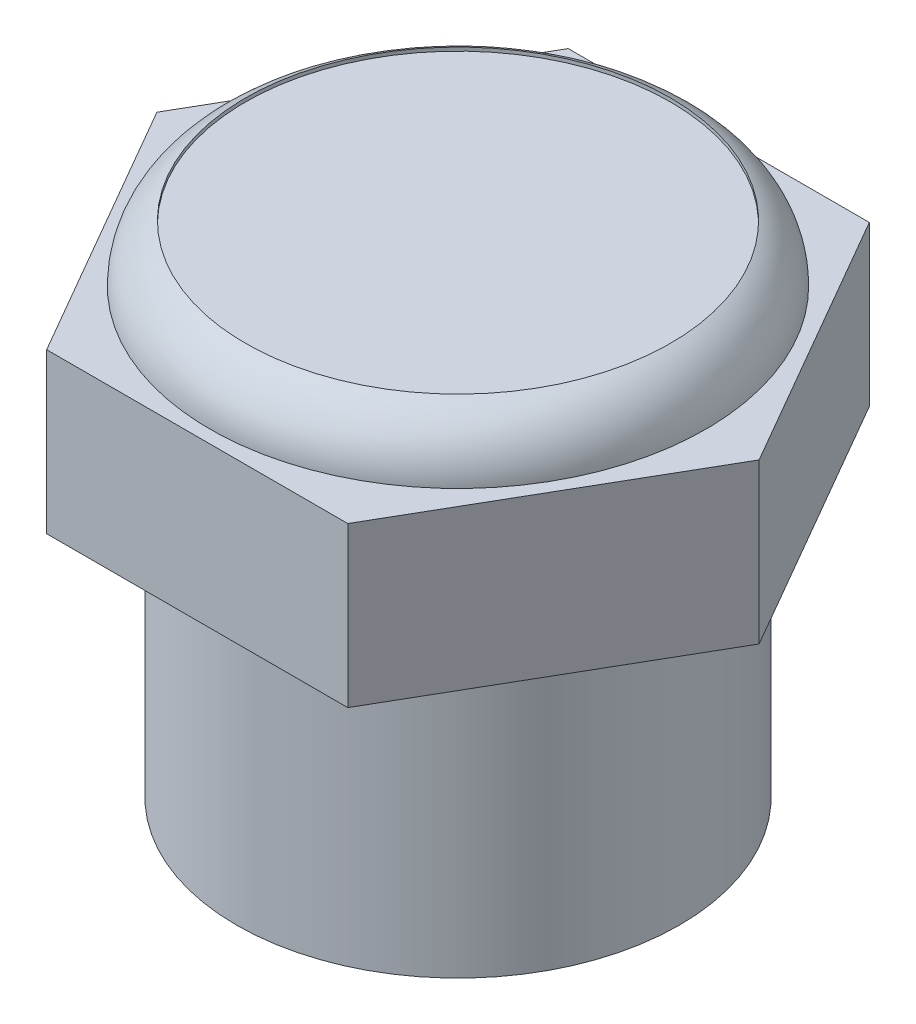
ISO-10303-21;
HEADER;
FILE_DESCRIPTION(('STEP AP214'),'2;1');
FILE_NAME('part.step','',(''),(''),'','','');
FILE_SCHEMA(('AUTOMOTIVE_DESIGN { 1 0 10303 214 1 1 1 1 }'));
ENDSEC;
DATA;
#1=APPLICATION_CONTEXT('core data for automotive mechanical design processes');
#2=APPLICATION_PROTOCOL_DEFINITION('international standard','automotive_design',2000,#1);
#3=PRODUCT_CONTEXT('',#1,'mechanical');
#4=PRODUCT('Part','Part','',(#3));
#5=PRODUCT_RELATED_PRODUCT_CATEGORY('part','',(#4));
#6=PRODUCT_DEFINITION_FORMATION('','',#4);
#7=PRODUCT_DEFINITION_CONTEXT('part definition',#1,'design');
#8=PRODUCT_DEFINITION('design','',#6,#7);
#9=PRODUCT_DEFINITION_SHAPE('','',#8);
#10=(LENGTH_UNIT() NAMED_UNIT(*) SI_UNIT(.MILLI.,.METRE.));
#11=(NAMED_UNIT(*) PLANE_ANGLE_UNIT() SI_UNIT($,.RADIAN.));
#12=(NAMED_UNIT(*) SI_UNIT($,.STERADIAN.) SOLID_ANGLE_UNIT());
#13=UNCERTAINTY_MEASURE_WITH_UNIT(LENGTH_MEASURE(1.E-05),#10,'distance_accuracy_value','');
#14=(GEOMETRIC_REPRESENTATION_CONTEXT(3) GLOBAL_UNCERTAINTY_ASSIGNED_CONTEXT((#13)) GLOBAL_UNIT_ASSIGNED_CONTEXT((#10,
#11,#12)) REPRESENTATION_CONTEXT('',''));
#15=CARTESIAN_POINT('',(0.,0.,0.));
#16=DIRECTION('',(0.,0.,1.));
#17=DIRECTION('',(1.,0.,0.));
#18=AXIS2_PLACEMENT_3D('',#15,#16,#17);
#19=CARTESIAN_POINT('',(0.,0.,0.));
#20=DIRECTION('',(0.,1.,0.));
#21=DIRECTION('',(0.,0.,1.));
#22=AXIS2_PLACEMENT_3D('',#19,#20,#21);
#23=PLANE('',#22);
#24=CARTESIAN_POINT('',(0.,0.,0.));
#25=DIRECTION('',(0.,1.,0.));
#26=DIRECTION('',(0.,0.,1.));
#27=AXIS2_PLACEMENT_3D('',#24,#25,#26);
#28=CIRCLE('',#27,6.25);
#29=CARTESIAN_POINT('',(0.,0.,6.25));
#30=VERTEX_POINT('',#29);
#31=EDGE_CURVE('E56',#30,#30,#28,.T.);
#32=ORIENTED_EDGE('',*,*,#31,.F.);
#33=EDGE_LOOP('',(#32));
#34=FACE_BOUND('',#33,.T.);
#35=CARTESIAN_POINT('',(0.,0.,0.));
#36=DIRECTION('',(0.,1.,0.));
#37=DIRECTION('',(0.,0.,1.));
#38=AXIS2_PLACEMENT_3D('',#35,#36,#37);
#39=CIRCLE('',#38,4.5);
#40=CARTESIAN_POINT('',(0.,0.,4.5));
#41=VERTEX_POINT('',#40);
#42=EDGE_CURVE('E168',#41,#41,#39,.T.);
#43=ORIENTED_EDGE('',*,*,#42,.T.);
#44=EDGE_LOOP('',(#43));
#45=FACE_BOUND('',#44,.T.);
#46=ADVANCED_FACE('F52',(#34,#45),#23,.F.);
#47=CARTESIAN_POINT('',(0.,8.,0.));
#48=DIRECTION('',(0.,-1.,0.));
#49=DIRECTION('',(0.,0.,-1.));
#50=AXIS2_PLACEMENT_3D('',#47,#48,#49);
#51=CYLINDRICAL_SURFACE('',#50,6.25);
#52=CARTESIAN_POINT('',(0.,8.,0.));
#53=DIRECTION('',(0.,1.,0.));
#54=DIRECTION('',(0.,0.,1.));
#55=AXIS2_PLACEMENT_3D('',#52,#53,#54);
#56=CIRCLE('',#55,6.25);
#57=CARTESIAN_POINT('',(0.,8.,6.25));
#58=VERTEX_POINT('',#57);
#59=EDGE_CURVE('E13',#58,#58,#56,.T.);
#60=ORIENTED_EDGE('',*,*,#59,.F.);
#61=EDGE_LOOP('',(#60));
#62=FACE_BOUND('',#61,.T.);
#63=ORIENTED_EDGE('',*,*,#31,.T.);
#64=EDGE_LOOP('',(#63));
#65=FACE_BOUND('',#64,.T.);
#66=ADVANCED_FACE('F54',(#62,#65),#51,.T.);
#67=CARTESIAN_POINT('',(0.,8.,0.));
#68=DIRECTION('',(0.,-1.,0.));
#69=DIRECTION('',(0.,0.,-1.));
#70=AXIS2_PLACEMENT_3D('',#67,#68,#69);
#71=CYLINDRICAL_SURFACE('',#70,4.5);
#72=CARTESIAN_POINT('',(0.,8.,0.));
#73=DIRECTION('',(0.,1.,0.));
#74=DIRECTION('',(0.,0.,1.));
#75=AXIS2_PLACEMENT_3D('',#72,#73,#74);
#76=CIRCLE('',#75,4.5);
#77=CARTESIAN_POINT('',(0.,8.,4.5));
#78=VERTEX_POINT('',#77);
#79=EDGE_CURVE('E164',#78,#78,#76,.T.);
#80=ORIENTED_EDGE('',*,*,#79,.T.);
#81=EDGE_LOOP('',(#80));
#82=FACE_BOUND('',#81,.T.);
#83=ORIENTED_EDGE('',*,*,#42,.F.);
#84=EDGE_LOOP('',(#83));
#85=FACE_BOUND('',#84,.T.);
#86=ADVANCED_FACE('F185',(#82,#85),#71,.F.);
#87=CARTESIAN_POINT('',(0.,8.,0.));
#88=DIRECTION('',(0.,1.,0.));
#89=DIRECTION('',(0.,0.,1.));
#90=AXIS2_PLACEMENT_3D('',#87,#88,#89);
#91=PLANE('',#90);
#92=ORIENTED_EDGE('',*,*,#79,.F.);
#93=EDGE_LOOP('',(#92));
#94=FACE_BOUND('',#93,.T.);
#95=ADVANCED_FACE('F190',(#94),#91,.F.);
#96=CARTESIAN_POINT('',(8.5,12.5,0.));
#97=DIRECTION('',(-0.866025403784439,0.,0.5));
#98=DIRECTION('',(0.5,0.,0.866025403784439));
#99=AXIS2_PLACEMENT_3D('',#96,#97,#98);
#100=PLANE('',#99);
#101=DIRECTION('',(-0.5,0.,-0.866025403784439));
#102=VECTOR('',#101,1.);
#103=CARTESIAN_POINT('',(8.5,8.,0.));
#104=LINE('',#103,#102);
#105=CARTESIAN_POINT('',(8.5,8.,0.));
#106=VERTEX_POINT('',#105);
#107=CARTESIAN_POINT('',(4.25,8.,-7.36121593216773));
#108=VERTEX_POINT('',#107);
#109=EDGE_CURVE('E143',#106,#108,#104,.T.);
#110=ORIENTED_EDGE('',*,*,#109,.T.);
#111=DIRECTION('',(0.,-1.,0.));
#112=VECTOR('',#111,1.);
#113=CARTESIAN_POINT('',(4.25,12.5,-7.36121593216773));
#114=LINE('',#113,#112);
#115=CARTESIAN_POINT('',(4.25,12.5,-7.36121593216773));
#116=VERTEX_POINT('',#115);
#117=EDGE_CURVE('E162',#116,#108,#114,.T.);
#118=ORIENTED_EDGE('',*,*,#117,.F.);
#119=DIRECTION('',(-0.5,0.,-0.866025403784439));
#120=VECTOR('',#119,1.);
#121=CARTESIAN_POINT('',(8.5,12.5,0.));
#122=LINE('',#121,#120);
#123=CARTESIAN_POINT('',(8.5,12.5,0.));
#124=VERTEX_POINT('',#123);
#125=EDGE_CURVE('E155',#124,#116,#122,.T.);
#126=ORIENTED_EDGE('',*,*,#125,.F.);
#127=DIRECTION('',(0.,-1.,0.));
#128=VECTOR('',#127,1.);
#129=CARTESIAN_POINT('',(8.5,12.5,0.));
#130=LINE('',#129,#128);
#131=EDGE_CURVE('E139',#124,#106,#130,.T.);
#132=ORIENTED_EDGE('',*,*,#131,.T.);
#133=EDGE_LOOP('',(#110,#118,#126,#132));
#134=FACE_BOUND('',#133,.T.);
#135=ADVANCED_FACE('F192',(#134),#100,.F.);
#136=CARTESIAN_POINT('',(4.25,12.5,-7.36121593216773));
#137=DIRECTION('',(0.,0.,1.));
#138=DIRECTION('',(1.,0.,0.));
#139=AXIS2_PLACEMENT_3D('',#136,#137,#138);
#140=PLANE('',#139);
#141=DIRECTION('',(-1.,0.,0.));
#142=VECTOR('',#141,1.);
#143=CARTESIAN_POINT('',(4.25,8.,-7.36121593216773));
#144=LINE('',#143,#142);
#145=CARTESIAN_POINT('',(-4.25,8.,-7.36121593216773));
#146=VERTEX_POINT('',#145);
#147=EDGE_CURVE('E146',#108,#146,#144,.T.);
#148=ORIENTED_EDGE('',*,*,#147,.T.);
#149=DIRECTION('',(0.,-1.,0.));
#150=VECTOR('',#149,1.);
#151=CARTESIAN_POINT('',(-4.25,12.5,-7.36121593216773));
#152=LINE('',#151,#150);
#153=CARTESIAN_POINT('',(-4.25,12.5,-7.36121593216773));
#154=VERTEX_POINT('',#153);
#155=EDGE_CURVE('E159',#154,#146,#152,.T.);
#156=ORIENTED_EDGE('',*,*,#155,.F.);
#157=DIRECTION('',(-1.,0.,0.));
#158=VECTOR('',#157,1.);
#159=CARTESIAN_POINT('',(4.25,12.5,-7.36121593216773));
#160=LINE('',#159,#158);
#161=EDGE_CURVE('E108',#116,#154,#160,.T.);
#162=ORIENTED_EDGE('',*,*,#161,.F.);
#163=ORIENTED_EDGE('',*,*,#117,.T.);
#164=EDGE_LOOP('',(#148,#156,#162,#163));
#165=FACE_BOUND('',#164,.T.);
#166=ADVANCED_FACE('F195',(#165),#140,.F.);
#167=CARTESIAN_POINT('',(-4.25,12.5,-7.36121593216773));
#168=DIRECTION('',(0.866025403784439,0.,0.5));
#169=DIRECTION('',(0.5,0.,-0.866025403784439));
#170=AXIS2_PLACEMENT_3D('',#167,#168,#169);
#171=PLANE('',#170);
#172=DIRECTION('',(-0.5,0.,0.866025403784439));
#173=VECTOR('',#172,1.);
#174=CARTESIAN_POINT('',(-4.25,8.,-7.36121593216773));
#175=LINE('',#174,#173);
#176=CARTESIAN_POINT('',(-8.5,8.,0.));
#177=VERTEX_POINT('',#176);
#178=EDGE_CURVE('E149',#146,#177,#175,.T.);
#179=ORIENTED_EDGE('',*,*,#178,.T.);
#180=DIRECTION('',(0.,-1.,0.));
#181=VECTOR('',#180,1.);
#182=CARTESIAN_POINT('',(-8.5,12.5,0.));
#183=LINE('',#182,#181);
#184=CARTESIAN_POINT('',(-8.5,12.5,0.));
#185=VERTEX_POINT('',#184);
#186=EDGE_CURVE('E130',#185,#177,#183,.T.);
#187=ORIENTED_EDGE('',*,*,#186,.F.);
#188=DIRECTION('',(-0.5,0.,0.866025403784439));
#189=VECTOR('',#188,1.);
#190=CARTESIAN_POINT('',(-4.25,12.5,-7.36121593216773));
#191=LINE('',#190,#189);
#192=EDGE_CURVE('E121',#154,#185,#191,.T.);
#193=ORIENTED_EDGE('',*,*,#192,.F.);
#194=ORIENTED_EDGE('',*,*,#155,.T.);
#195=EDGE_LOOP('',(#179,#187,#193,#194));
#196=FACE_BOUND('',#195,.T.);
#197=ADVANCED_FACE('F199',(#196),#171,.F.);
#198=CARTESIAN_POINT('',(-8.5,12.5,0.));
#199=DIRECTION('',(0.866025403784439,0.,-0.5));
#200=DIRECTION('',(-0.5,0.,-0.866025403784439));
#201=AXIS2_PLACEMENT_3D('',#198,#199,#200);
#202=PLANE('',#201);
#203=DIRECTION('',(0.5,0.,0.866025403784439));
#204=VECTOR('',#203,1.);
#205=CARTESIAN_POINT('',(-8.5,8.,0.));
#206=LINE('',#205,#204);
#207=CARTESIAN_POINT('',(-4.25,8.,7.36121593216773));
#208=VERTEX_POINT('',#207);
#209=EDGE_CURVE('E129',#177,#208,#206,.T.);
#210=ORIENTED_EDGE('',*,*,#209,.T.);
#211=DIRECTION('',(0.,-1.,0.));
#212=VECTOR('',#211,1.);
#213=CARTESIAN_POINT('',(-4.25,12.5,7.36121593216773));
#214=LINE('',#213,#212);
#215=CARTESIAN_POINT('',(-4.25,12.5,7.36121593216773));
#216=VERTEX_POINT('',#215);
#217=EDGE_CURVE('E126',#216,#208,#214,.T.);
#218=ORIENTED_EDGE('',*,*,#217,.F.);
#219=DIRECTION('',(0.5,0.,0.866025403784439));
#220=VECTOR('',#219,1.);
#221=CARTESIAN_POINT('',(-8.5,12.5,0.));
#222=LINE('',#221,#220);
#223=EDGE_CURVE('E115',#185,#216,#222,.T.);
#224=ORIENTED_EDGE('',*,*,#223,.F.);
#225=ORIENTED_EDGE('',*,*,#186,.T.);
#226=EDGE_LOOP('',(#210,#218,#224,#225));
#227=FACE_BOUND('',#226,.T.);
#228=ADVANCED_FACE('F127',(#227),#202,.F.);
#229=CARTESIAN_POINT('',(-4.25,12.5,7.36121593216773));
#230=DIRECTION('',(0.,0.,-1.));
#231=DIRECTION('',(-1.,0.,0.));
#232=AXIS2_PLACEMENT_3D('',#229,#230,#231);
#233=PLANE('',#232);
#234=DIRECTION('',(1.,0.,0.));
#235=VECTOR('',#234,1.);
#236=CARTESIAN_POINT('',(-4.25,8.,7.36121593216773));
#237=LINE('',#236,#235);
#238=CARTESIAN_POINT('',(4.25,8.,7.36121593216773));
#239=VERTEX_POINT('',#238);
#240=EDGE_CURVE('E93',#208,#239,#237,.T.);
#241=ORIENTED_EDGE('',*,*,#240,.T.);
#242=DIRECTION('',(0.,-1.,0.));
#243=VECTOR('',#242,1.);
#244=CARTESIAN_POINT('',(4.25,12.5,7.36121593216773));
#245=LINE('',#244,#243);
#246=CARTESIAN_POINT('',(4.25,12.5,7.36121593216773));
#247=VERTEX_POINT('',#246);
#248=EDGE_CURVE('E131',#247,#239,#245,.T.);
#249=ORIENTED_EDGE('',*,*,#248,.F.);
#250=DIRECTION('',(1.,0.,0.));
#251=VECTOR('',#250,1.);
#252=CARTESIAN_POINT('',(-4.25,12.5,7.36121593216773));
#253=LINE('',#252,#251);
#254=EDGE_CURVE('E119',#216,#247,#253,.T.);
#255=ORIENTED_EDGE('',*,*,#254,.F.);
#256=ORIENTED_EDGE('',*,*,#217,.T.);
#257=EDGE_LOOP('',(#241,#249,#255,#256));
#258=FACE_BOUND('',#257,.T.);
#259=ADVANCED_FACE('F133',(#258),#233,.F.);
#260=CARTESIAN_POINT('',(4.25,12.5,7.36121593216773));
#261=DIRECTION('',(-0.866025403784439,0.,-0.5));
#262=DIRECTION('',(-0.5,0.,0.866025403784439));
#263=AXIS2_PLACEMENT_3D('',#260,#261,#262);
#264=PLANE('',#263);
#265=DIRECTION('',(0.5,0.,-0.866025403784439));
#266=VECTOR('',#265,1.);
#267=CARTESIAN_POINT('',(4.25,8.,7.36121593216773));
#268=LINE('',#267,#266);
#269=EDGE_CURVE('E99',#239,#106,#268,.T.);
#270=ORIENTED_EDGE('',*,*,#269,.T.);
#271=ORIENTED_EDGE('',*,*,#131,.F.);
#272=DIRECTION('',(0.5,0.,-0.866025403784439));
#273=VECTOR('',#272,1.);
#274=CARTESIAN_POINT('',(4.25,12.5,7.36121593216773));
#275=LINE('',#274,#273);
#276=EDGE_CURVE('E70',#247,#124,#275,.T.);
#277=ORIENTED_EDGE('',*,*,#276,.F.);
#278=ORIENTED_EDGE('',*,*,#248,.T.);
#279=EDGE_LOOP('',(#270,#271,#277,#278));
#280=FACE_BOUND('',#279,.T.);
#281=ADVANCED_FACE('F207',(#280),#264,.F.);
#282=CARTESIAN_POINT('',(0.,12.5,0.));
#283=DIRECTION('',(0.,1.,0.));
#284=DIRECTION('',(0.,0.,1.));
#285=AXIS2_PLACEMENT_3D('',#282,#283,#284);
#286=PLANE('',#285);
#287=CARTESIAN_POINT('',(0.,12.5,0.));
#288=DIRECTION('',(0.,-1.,0.));
#289=DIRECTION('',(0.,0.,-1.));
#290=AXIS2_PLACEMENT_3D('',#287,#288,#289);
#291=CIRCLE('',#290,7.);
#292=CARTESIAN_POINT('',(0.,12.5,-7.));
#293=VERTEX_POINT('',#292);
#294=EDGE_CURVE('E233',#293,#293,#291,.T.);
#295=ORIENTED_EDGE('',*,*,#294,.T.);
#296=EDGE_LOOP('',(#295));
#297=FACE_BOUND('',#296,.T.);
#298=ORIENTED_EDGE('',*,*,#125,.T.);
#299=ORIENTED_EDGE('',*,*,#161,.T.);
#300=ORIENTED_EDGE('',*,*,#192,.T.);
#301=ORIENTED_EDGE('',*,*,#223,.T.);
#302=ORIENTED_EDGE('',*,*,#254,.T.);
#303=ORIENTED_EDGE('',*,*,#276,.T.);
#304=EDGE_LOOP('',(#298,#299,#300,#301,#302,#303));
#305=FACE_BOUND('',#304,.T.);
#306=ADVANCED_FACE('F117',(#297,#305),#286,.T.);
#307=ORIENTED_EDGE('',*,*,#59,.T.);
#308=EDGE_LOOP('',(#307));
#309=FACE_BOUND('',#308,.T.);
#310=ORIENTED_EDGE('',*,*,#109,.F.);
#311=ORIENTED_EDGE('',*,*,#269,.F.);
#312=ORIENTED_EDGE('',*,*,#240,.F.);
#313=ORIENTED_EDGE('',*,*,#209,.F.);
#314=ORIENTED_EDGE('',*,*,#178,.F.);
#315=ORIENTED_EDGE('',*,*,#147,.F.);
#316=EDGE_LOOP('',(#310,#311,#312,#313,#314,#315));
#317=FACE_BOUND('',#316,.T.);
#318=ADVANCED_FACE('F210',(#309,#317),#91,.F.);
#319=CARTESIAN_POINT('',(0.,12.5,0.));
#320=DIRECTION('',(0.,-1.,0.));
#321=DIRECTION('',(0.,0.,-1.));
#322=AXIS2_PLACEMENT_3D('',#319,#320,#321);
#323=TOROIDAL_SURFACE('',#322,5.22,1.78);
#324=ORIENTED_EDGE('',*,*,#294,.F.);
#325=EDGE_LOOP('',(#324));
#326=FACE_BOUND('',#325,.T.);
#327=CARTESIAN_POINT('',(0.,14.1,0.));
#328=DIRECTION('',(0.,-1.,0.));
#329=DIRECTION('',(0.,0.,-1.));
#330=AXIS2_PLACEMENT_3D('',#327,#328,#329);
#331=CIRCLE('',#330,6.);
#332=CARTESIAN_POINT('',(0.,14.1,-6.));
#333=VERTEX_POINT('',#332);
#334=EDGE_CURVE('E147',#333,#333,#331,.T.);
#335=ORIENTED_EDGE('',*,*,#334,.T.);
#336=EDGE_LOOP('',(#335));
#337=FACE_BOUND('',#336,.T.);
#338=ADVANCED_FACE('F213',(#326,#337),#323,.T.);
#339=CARTESIAN_POINT('',(0.,-20.8111088197826,0.));
#340=DIRECTION('',(0.,-1.,0.));
#341=DIRECTION('',(0.,0.,-1.));
#342=AXIS2_PLACEMENT_3D('',#339,#340,#341);
#343=CYLINDRICAL_SURFACE('',#342,6.);
#344=CARTESIAN_POINT('',(0.,14.,0.));
#345=DIRECTION('',(0.,-1.,0.));
#346=DIRECTION('',(0.,0.,-1.));
#347=AXIS2_PLACEMENT_3D('',#344,#345,#346);
#348=CIRCLE('',#347,6.);
#349=CARTESIAN_POINT('',(0.,14.,-6.));
#350=VERTEX_POINT('',#349);
#351=EDGE_CURVE('E232',#350,#350,#348,.T.);
#352=ORIENTED_EDGE('',*,*,#351,.T.);
#353=EDGE_LOOP('',(#352));
#354=FACE_BOUND('',#353,.T.);
#355=ORIENTED_EDGE('',*,*,#334,.F.);
#356=EDGE_LOOP('',(#355));
#357=FACE_BOUND('',#356,.T.);
#358=ADVANCED_FACE('F220',(#354,#357),#343,.F.);
#359=CARTESIAN_POINT('',(0.,14.,0.));
#360=DIRECTION('',(0.,1.,0.));
#361=DIRECTION('',(0.,0.,1.));
#362=AXIS2_PLACEMENT_3D('',#359,#360,#361);
#363=PLANE('',#362);
#364=ORIENTED_EDGE('',*,*,#351,.F.);
#365=EDGE_LOOP('',(#364));
#366=FACE_BOUND('',#365,.T.);
#367=ADVANCED_FACE('F224',(#366),#363,.T.);
#368=CLOSED_SHELL('',(#46,#66,#86,#95,#135,#166,#197,#228,#259,#281,#306,#318,#338,#358,#367));
#369=MANIFOLD_SOLID_BREP('B2',#368);
#370=ADVANCED_BREP_SHAPE_REPRESENTATION('',(#18,#369),#14);
#371=SHAPE_DEFINITION_REPRESENTATION(#9,#370);
ENDSEC;
END-ISO-10303-21;
